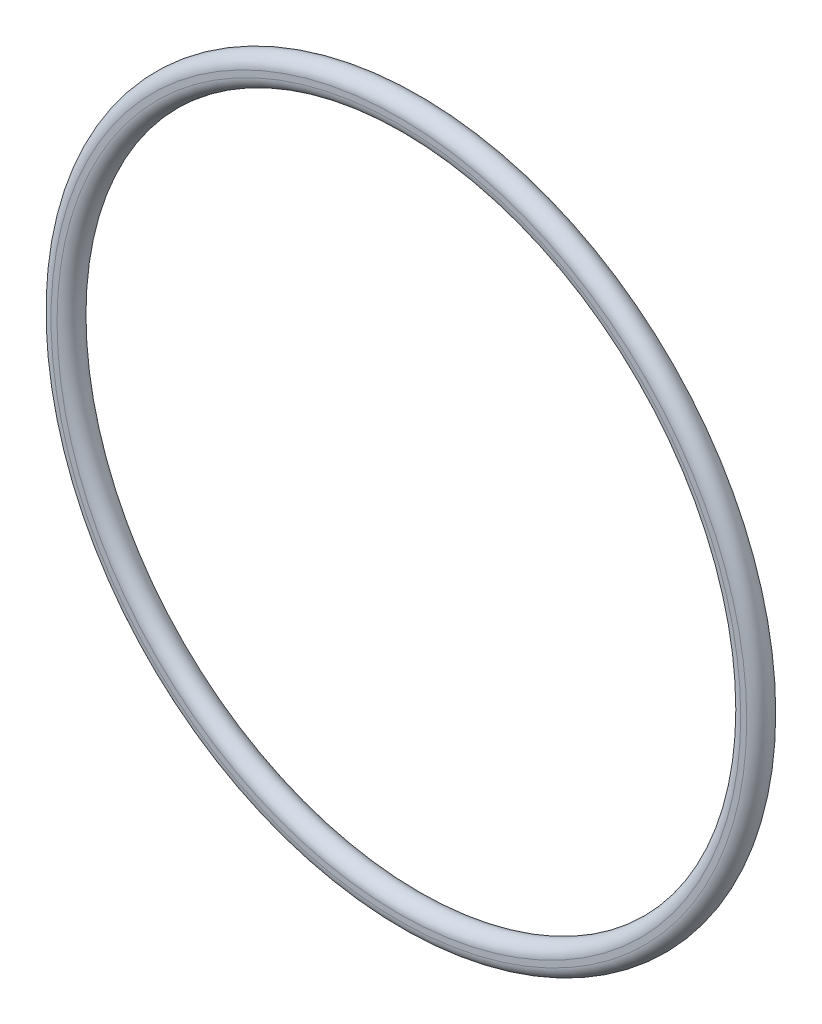
ISO-10303-21;
HEADER;
FILE_DESCRIPTION(('STEP AP214'),'2;1');
FILE_NAME('part.step','',(''),(''),'','','');
FILE_SCHEMA(('AUTOMOTIVE_DESIGN { 1 0 10303 214 1 1 1 1 }'));
ENDSEC;
DATA;
#1=APPLICATION_CONTEXT('core data for automotive mechanical design processes');
#2=APPLICATION_PROTOCOL_DEFINITION('international standard','automotive_design',2000,#1);
#3=PRODUCT_CONTEXT('',#1,'mechanical');
#4=PRODUCT('Part','Part','',(#3));
#5=PRODUCT_RELATED_PRODUCT_CATEGORY('part','',(#4));
#6=PRODUCT_DEFINITION_FORMATION('','',#4);
#7=PRODUCT_DEFINITION_CONTEXT('part definition',#1,'design');
#8=PRODUCT_DEFINITION('design','',#6,#7);
#9=PRODUCT_DEFINITION_SHAPE('','',#8);
#10=(LENGTH_UNIT() NAMED_UNIT(*) SI_UNIT(.MILLI.,.METRE.));
#11=(NAMED_UNIT(*) PLANE_ANGLE_UNIT() SI_UNIT($,.RADIAN.));
#12=(NAMED_UNIT(*) SI_UNIT($,.STERADIAN.) SOLID_ANGLE_UNIT());
#13=UNCERTAINTY_MEASURE_WITH_UNIT(LENGTH_MEASURE(1.E-05),#10,'distance_accuracy_value','');
#14=(GEOMETRIC_REPRESENTATION_CONTEXT(3) GLOBAL_UNCERTAINTY_ASSIGNED_CONTEXT((#13)) GLOBAL_UNIT_ASSIGNED_CONTEXT((#10,
#11,#12)) REPRESENTATION_CONTEXT('',''));
#15=CARTESIAN_POINT('',(0.,0.,0.));
#16=DIRECTION('',(0.,0.,1.));
#17=DIRECTION('',(1.,0.,0.));
#18=AXIS2_PLACEMENT_3D('',#15,#16,#17);
#19=CARTESIAN_POINT('',(0.,0.,-0.79375));
#20=DIRECTION('',(0.,0.,-1.));
#21=DIRECTION('',(-1.,0.,0.));
#22=AXIS2_PLACEMENT_3D('',#19,#20,#21);
#23=PLANE('',#22);
#24=CARTESIAN_POINT('',(0.,0.,-0.79375));
#25=DIRECTION('',(0.,0.,1.));
#26=DIRECTION('',(1.,0.,0.));
#27=AXIS2_PLACEMENT_3D('',#24,#25,#26);
#28=CIRCLE('',#27,22.621875);
#29=CARTESIAN_POINT('',(22.621875,0.,-0.79375));
#30=VERTEX_POINT('',#29);
#31=EDGE_CURVE('E10',#30,#30,#28,.T.);
#32=ORIENTED_EDGE('',*,*,#31,.T.);
#33=EDGE_LOOP('',(#32));
#34=FACE_BOUND('',#33,.T.);
#35=CARTESIAN_POINT('',(0.,0.,-0.79375));
#36=DIRECTION('',(0.,0.,1.));
#37=DIRECTION('',(1.,0.,0.));
#38=AXIS2_PLACEMENT_3D('',#35,#36,#37);
#39=CIRCLE('',#38,23.01875);
#40=CARTESIAN_POINT('',(23.01875,0.,-0.79375));
#41=VERTEX_POINT('',#40);
#42=EDGE_CURVE('E51',#41,#41,#39,.T.);
#43=ORIENTED_EDGE('',*,*,#42,.F.);
#44=EDGE_LOOP('',(#43));
#45=FACE_BOUND('',#44,.T.);
#46=ADVANCED_FACE('F37',(#34,#45),#23,.T.);
#47=CARTESIAN_POINT('',(0.,0.,0.));
#48=DIRECTION('',(0.,0.,1.));
#49=DIRECTION('',(1.,0.,0.));
#50=AXIS2_PLACEMENT_3D('',#47,#48,#49);
#51=TOROIDAL_SURFACE('',#50,22.621875,0.79375);
#52=CARTESIAN_POINT('',(0.,0.,0.79375));
#53=DIRECTION('',(0.,0.,1.));
#54=DIRECTION('',(1.,0.,0.));
#55=AXIS2_PLACEMENT_3D('',#52,#53,#54);
#56=CIRCLE('',#55,22.621875);
#57=CARTESIAN_POINT('',(22.621875,0.,0.79375));
#58=VERTEX_POINT('',#57);
#59=EDGE_CURVE('E43',#58,#58,#56,.T.);
#60=ORIENTED_EDGE('',*,*,#59,.T.);
#61=EDGE_LOOP('',(#60));
#62=FACE_BOUND('',#61,.T.);
#63=ORIENTED_EDGE('',*,*,#31,.F.);
#64=EDGE_LOOP('',(#63));
#65=FACE_BOUND('',#64,.T.);
#66=ADVANCED_FACE('F61',(#62,#65),#51,.T.);
#67=CARTESIAN_POINT('',(0.,0.,0.79375));
#68=DIRECTION('',(0.,0.,-1.));
#69=DIRECTION('',(-1.,0.,0.));
#70=AXIS2_PLACEMENT_3D('',#67,#68,#69);
#71=PLANE('',#70);
#72=ORIENTED_EDGE('',*,*,#59,.F.);
#73=EDGE_LOOP('',(#72));
#74=FACE_BOUND('',#73,.T.);
#75=CARTESIAN_POINT('',(0.,0.,0.793749999999999));
#76=DIRECTION('',(0.,0.,1.));
#77=DIRECTION('',(1.,0.,0.));
#78=AXIS2_PLACEMENT_3D('',#75,#76,#77);
#79=CIRCLE('',#78,23.01875);
#80=CARTESIAN_POINT('',(23.01875,0.,0.793749999999999));
#81=VERTEX_POINT('',#80);
#82=EDGE_CURVE('E47',#81,#81,#79,.T.);
#83=ORIENTED_EDGE('',*,*,#82,.T.);
#84=EDGE_LOOP('',(#83));
#85=FACE_BOUND('',#84,.T.);
#86=ADVANCED_FACE('F65',(#74,#85),#71,.F.);
#87=CARTESIAN_POINT('',(0.,0.,0.));
#88=DIRECTION('',(0.,0.,1.));
#89=DIRECTION('',(1.,0.,0.));
#90=AXIS2_PLACEMENT_3D('',#87,#88,#89);
#91=TOROIDAL_SURFACE('',#90,23.01875,0.793749999999999);
#92=ORIENTED_EDGE('',*,*,#42,.T.);
#93=EDGE_LOOP('',(#92));
#94=FACE_BOUND('',#93,.T.);
#95=ORIENTED_EDGE('',*,*,#82,.F.);
#96=EDGE_LOOP('',(#95));
#97=FACE_BOUND('',#96,.T.);
#98=ADVANCED_FACE('F57',(#94,#97),#91,.T.);
#99=CLOSED_SHELL('',(#46,#66,#86,#98));
#100=MANIFOLD_SOLID_BREP('B2',#99);
#101=ADVANCED_BREP_SHAPE_REPRESENTATION('',(#18,#100),#14);
#102=SHAPE_DEFINITION_REPRESENTATION(#9,#101);
ENDSEC;
END-ISO-10303-21;
